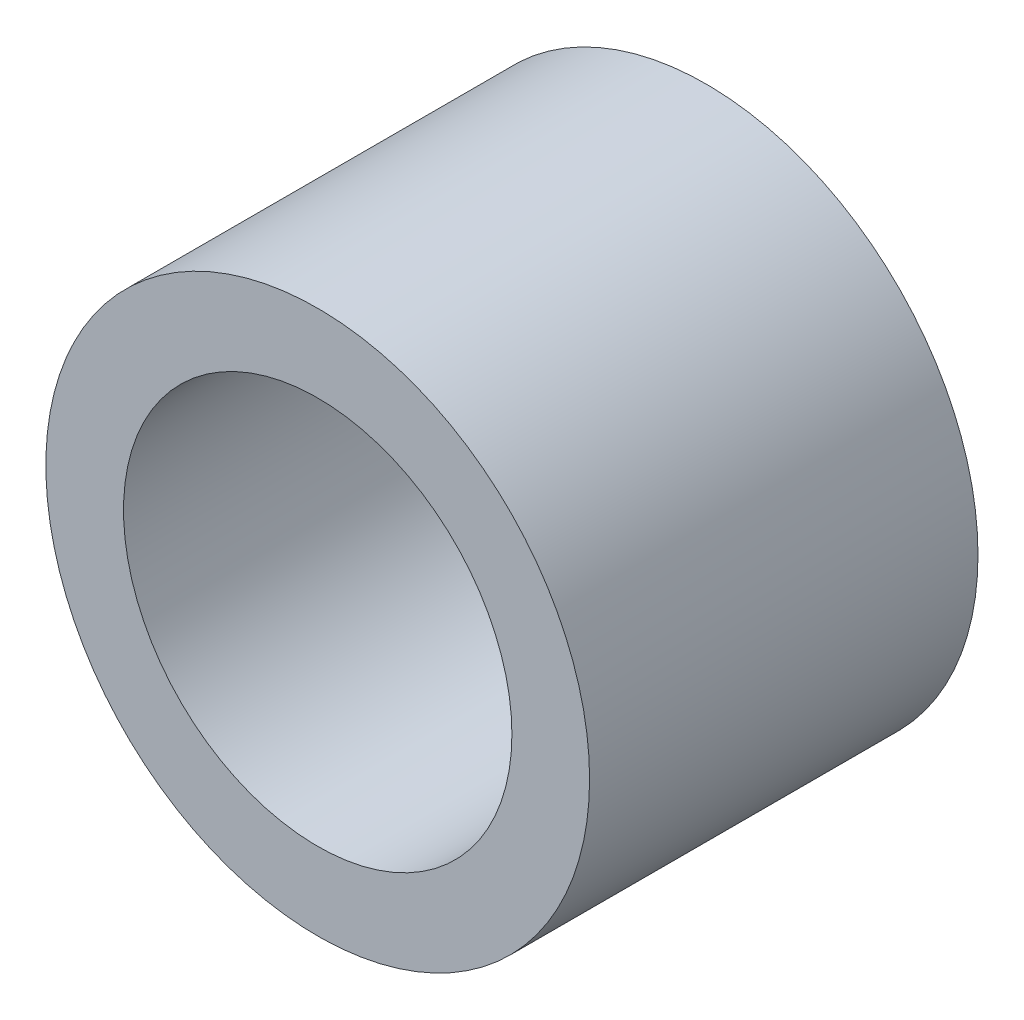
ISO-10303-21;
HEADER;
FILE_DESCRIPTION(('STEP AP214'),'2;1');
FILE_NAME('part.step','',(''),(''),'','','');
FILE_SCHEMA(('AUTOMOTIVE_DESIGN { 1 0 10303 214 1 1 1 1 }'));
ENDSEC;
DATA;
#1=APPLICATION_CONTEXT('core data for automotive mechanical design processes');
#2=APPLICATION_PROTOCOL_DEFINITION('international standard','automotive_design',2000,#1);
#3=PRODUCT_CONTEXT('',#1,'mechanical');
#4=PRODUCT('Part','Part','',(#3));
#5=PRODUCT_RELATED_PRODUCT_CATEGORY('part','',(#4));
#6=PRODUCT_DEFINITION_FORMATION('','',#4);
#7=PRODUCT_DEFINITION_CONTEXT('part definition',#1,'design');
#8=PRODUCT_DEFINITION('design','',#6,#7);
#9=PRODUCT_DEFINITION_SHAPE('','',#8);
#10=(LENGTH_UNIT() NAMED_UNIT(*) SI_UNIT(.MILLI.,.METRE.));
#11=(NAMED_UNIT(*) PLANE_ANGLE_UNIT() SI_UNIT($,.RADIAN.));
#12=(NAMED_UNIT(*) SI_UNIT($,.STERADIAN.) SOLID_ANGLE_UNIT());
#13=UNCERTAINTY_MEASURE_WITH_UNIT(LENGTH_MEASURE(1.E-05),#10,'distance_accuracy_value','');
#14=(GEOMETRIC_REPRESENTATION_CONTEXT(3) GLOBAL_UNCERTAINTY_ASSIGNED_CONTEXT((#13)) GLOBAL_UNIT_ASSIGNED_CONTEXT((#10,
#11,#12)) REPRESENTATION_CONTEXT('',''));
#15=CARTESIAN_POINT('',(0.,0.,0.));
#16=DIRECTION('',(0.,0.,1.));
#17=DIRECTION('',(1.,0.,0.));
#18=AXIS2_PLACEMENT_3D('',#15,#16,#17);
#19=CARTESIAN_POINT('',(0.,0.,5.));
#20=DIRECTION('',(0.,0.,1.));
#21=DIRECTION('',(1.,0.,0.));
#22=AXIS2_PLACEMENT_3D('',#19,#20,#21);
#23=PLANE('',#22);
#24=CARTESIAN_POINT('',(0.,0.,5.));
#25=DIRECTION('',(0.,0.,1.));
#26=DIRECTION('',(1.,0.,0.));
#27=AXIS2_PLACEMENT_3D('',#24,#25,#26);
#28=CIRCLE('',#27,3.5);
#29=CARTESIAN_POINT('',(3.5,0.,5.));
#30=VERTEX_POINT('',#29);
#31=EDGE_CURVE('E10',#30,#30,#28,.T.);
#32=ORIENTED_EDGE('',*,*,#31,.T.);
#33=EDGE_LOOP('',(#32));
#34=FACE_BOUND('',#33,.T.);
#35=CARTESIAN_POINT('',(0.,0.,5.));
#36=DIRECTION('',(0.,0.,1.));
#37=DIRECTION('',(1.,0.,0.));
#38=AXIS2_PLACEMENT_3D('',#35,#36,#37);
#39=CIRCLE('',#38,2.5);
#40=CARTESIAN_POINT('',(2.5,0.,5.));
#41=VERTEX_POINT('',#40);
#42=EDGE_CURVE('E56',#41,#41,#39,.T.);
#43=ORIENTED_EDGE('',*,*,#42,.F.);
#44=EDGE_LOOP('',(#43));
#45=FACE_BOUND('',#44,.T.);
#46=ADVANCED_FACE('F43',(#34,#45),#23,.T.);
#47=CARTESIAN_POINT('',(0.,0.,0.));
#48=DIRECTION('',(0.,0.,1.));
#49=DIRECTION('',(1.,0.,0.));
#50=AXIS2_PLACEMENT_3D('',#47,#48,#49);
#51=PLANE('',#50);
#52=CARTESIAN_POINT('',(0.,0.,0.));
#53=DIRECTION('',(0.,0.,1.));
#54=DIRECTION('',(1.,0.,0.));
#55=AXIS2_PLACEMENT_3D('',#52,#53,#54);
#56=CIRCLE('',#55,3.5);
#57=CARTESIAN_POINT('',(3.5,0.,0.));
#58=VERTEX_POINT('',#57);
#59=EDGE_CURVE('E47',#58,#58,#56,.T.);
#60=ORIENTED_EDGE('',*,*,#59,.F.);
#61=EDGE_LOOP('',(#60));
#62=FACE_BOUND('',#61,.T.);
#63=CARTESIAN_POINT('',(0.,0.,0.));
#64=DIRECTION('',(0.,0.,1.));
#65=DIRECTION('',(1.,0.,0.));
#66=AXIS2_PLACEMENT_3D('',#63,#64,#65);
#67=CIRCLE('',#66,2.5);
#68=CARTESIAN_POINT('',(2.5,0.,0.));
#69=VERTEX_POINT('',#68);
#70=EDGE_CURVE('E58',#69,#69,#67,.T.);
#71=ORIENTED_EDGE('',*,*,#70,.T.);
#72=EDGE_LOOP('',(#71));
#73=FACE_BOUND('',#72,.T.);
#74=ADVANCED_FACE('F70',(#62,#73),#51,.F.);
#75=CARTESIAN_POINT('',(0.,0.,5.));
#76=DIRECTION('',(0.,0.,-1.));
#77=DIRECTION('',(-1.,0.,0.));
#78=AXIS2_PLACEMENT_3D('',#75,#76,#77);
#79=CYLINDRICAL_SURFACE('',#78,3.5);
#80=ORIENTED_EDGE('',*,*,#31,.F.);
#81=EDGE_LOOP('',(#80));
#82=FACE_BOUND('',#81,.T.);
#83=ORIENTED_EDGE('',*,*,#59,.T.);
#84=EDGE_LOOP('',(#83));
#85=FACE_BOUND('',#84,.T.);
#86=ADVANCED_FACE('F45',(#82,#85),#79,.T.);
#87=CARTESIAN_POINT('',(0.,0.,5.));
#88=DIRECTION('',(0.,0.,-1.));
#89=DIRECTION('',(-1.,0.,0.));
#90=AXIS2_PLACEMENT_3D('',#87,#88,#89);
#91=CYLINDRICAL_SURFACE('',#90,2.5);
#92=ORIENTED_EDGE('',*,*,#42,.T.);
#93=EDGE_LOOP('',(#92));
#94=FACE_BOUND('',#93,.T.);
#95=ORIENTED_EDGE('',*,*,#70,.F.);
#96=EDGE_LOOP('',(#95));
#97=FACE_BOUND('',#96,.T.);
#98=ADVANCED_FACE('F66',(#94,#97),#91,.F.);
#99=CLOSED_SHELL('',(#46,#74,#86,#98));
#100=MANIFOLD_SOLID_BREP('B2',#99);
#101=ADVANCED_BREP_SHAPE_REPRESENTATION('',(#18,#100),#14);
#102=SHAPE_DEFINITION_REPRESENTATION(#9,#101);
ENDSEC;
END-ISO-10303-21;
